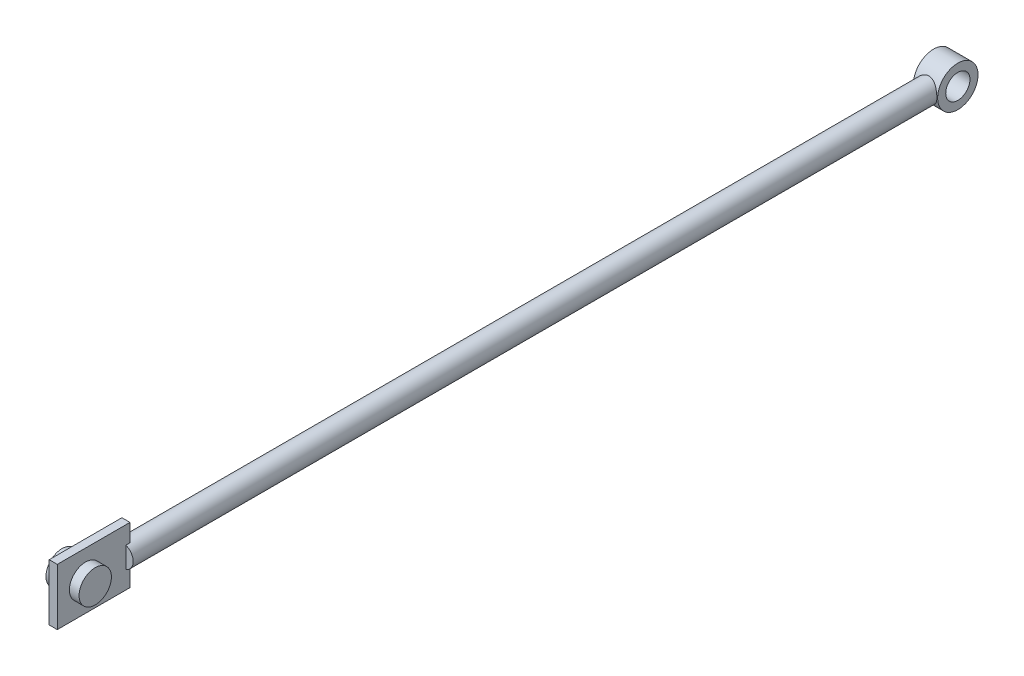
ISO-10303-21;
HEADER;
FILE_DESCRIPTION(('STEP AP214'),'2;1');
FILE_NAME('part.step','',(''),(''),'','','');
FILE_SCHEMA(('AUTOMOTIVE_DESIGN { 1 0 10303 214 1 1 1 1 }'));
ENDSEC;
DATA;
#1=APPLICATION_CONTEXT('core data for automotive mechanical design processes');
#2=APPLICATION_PROTOCOL_DEFINITION('international standard','automotive_design',2000,#1);
#3=PRODUCT_CONTEXT('',#1,'mechanical');
#4=PRODUCT('Part','Part','',(#3));
#5=PRODUCT_RELATED_PRODUCT_CATEGORY('part','',(#4));
#6=PRODUCT_DEFINITION_FORMATION('','',#4);
#7=PRODUCT_DEFINITION_CONTEXT('part definition',#1,'design');
#8=PRODUCT_DEFINITION('design','',#6,#7);
#9=PRODUCT_DEFINITION_SHAPE('','',#8);
#10=(LENGTH_UNIT() NAMED_UNIT(*) SI_UNIT(.MILLI.,.METRE.));
#11=(NAMED_UNIT(*) PLANE_ANGLE_UNIT() SI_UNIT($,.RADIAN.));
#12=(NAMED_UNIT(*) SI_UNIT($,.STERADIAN.) SOLID_ANGLE_UNIT());
#13=UNCERTAINTY_MEASURE_WITH_UNIT(LENGTH_MEASURE(1.E-05),#10,'distance_accuracy_value','');
#14=(GEOMETRIC_REPRESENTATION_CONTEXT(3) GLOBAL_UNCERTAINTY_ASSIGNED_CONTEXT((#13)) GLOBAL_UNIT_ASSIGNED_CONTEXT((#10,
#11,#12)) REPRESENTATION_CONTEXT('',''));
#15=CARTESIAN_POINT('',(0.,0.,0.));
#16=DIRECTION('',(0.,0.,1.));
#17=DIRECTION('',(1.,0.,0.));
#18=AXIS2_PLACEMENT_3D('',#15,#16,#17);
#19=CARTESIAN_POINT('',(0.,0.,100.));
#20=DIRECTION('',(0.,0.,-1.));
#21=DIRECTION('',(-1.,0.,0.));
#22=AXIS2_PLACEMENT_3D('',#19,#20,#21);
#23=CYLINDRICAL_SURFACE('',#22,1.4);
#24=CARTESIAN_POINT('',(-1.4,0.,0.499999999999998));
#25=CARTESIAN_POINT('',(-1.40000289659873,-0.0725818689730918,0.500002520776899));
#26=CARTESIAN_POINT('',(-1.39433133035632,-0.145147059210999,0.496812613091404));
#27=CARTESIAN_POINT('',(-1.37196021256065,-0.288016997267102,0.484388938821093));
#28=CARTESIAN_POINT('',(-1.35525926953171,-0.35832145869601,0.475154409642917));
#29=CARTESIAN_POINT('',(-1.3117124098072,-0.494475170763166,0.451582636287804));
#30=CARTESIAN_POINT('',(-1.28490387285422,-0.560339795458176,0.4372642045506));
#31=CARTESIAN_POINT('',(-1.22215902977669,-0.686510478104349,0.404777141676712));
#32=CARTESIAN_POINT('',(-1.18622048846178,-0.746815169948827,0.386607567891455));
#33=CARTESIAN_POINT('',(-1.10340706767021,-0.864901258370252,0.34650853836439));
#34=CARTESIAN_POINT('',(-1.05594134550337,-0.922207928188873,0.324404634506324));
#35=CARTESIAN_POINT('',(-0.952721258461023,-1.02850336667495,0.279368325353988));
#36=CARTESIAN_POINT('',(-0.896958365530866,-1.07748346476577,0.256435086224085));
#37=CARTESIAN_POINT('',(-0.771889428270987,-1.17085060892693,0.209549655418918));
#38=CARTESIAN_POINT('',(-0.701779248609789,-1.21423931000865,0.185737232860964));
#39=CARTESIAN_POINT('',(-0.553881240003987,-1.28842263311707,0.142851816901154));
#40=CARTESIAN_POINT('',(-0.476104772318213,-1.31923555387748,0.123771953243341));
#41=CARTESIAN_POINT('',(-0.332085921068109,-1.3616501036544,0.096759663144412));
#42=CARTESIAN_POINT('',(-0.266920664324053,-1.37594726130742,0.0873177352789558));
#43=CARTESIAN_POINT('',(-0.134653309423798,-1.3951063945149,0.0745642457264337));
#44=CARTESIAN_POINT('',(-0.0675532343343101,-1.39997788675499,0.0712465008732006));
#45=CARTESIAN_POINT('',(0.0667273688799501,-1.40002199297853,0.0712166158174327));
#46=CARTESIAN_POINT('',(0.133907899577255,-1.39518329024686,0.0745121830778766));
#47=CARTESIAN_POINT('',(0.266325246678815,-1.37606434146031,0.0872406395516563));
#48=CARTESIAN_POINT('',(0.331560749621589,-1.3617778598451,0.0966775820241706));
#49=CARTESIAN_POINT('',(0.458435728199665,-1.32446590427588,0.120441630267713));
#50=CARTESIAN_POINT('',(0.52007824241421,-1.30144794194266,0.134764531624939));
#51=CARTESIAN_POINT('',(0.638826601856177,-1.24746154369203,0.166753855604164));
#52=CARTESIAN_POINT('',(0.69593067248779,-1.21649001765185,0.184421577054746));
#53=CARTESIAN_POINT('',(0.813333390049971,-1.14194614545546,0.224412105531137));
#54=CARTESIAN_POINT('',(0.872765521257123,-1.09716690393685,0.247032557278383));
#55=CARTESIAN_POINT('',(0.983817953241206,-0.998804901734401,0.292450034384635));
#56=CARTESIAN_POINT('',(1.03543188432828,-0.945215036141927,0.31524718798208));
#57=CARTESIAN_POINT('',(1.13480526712122,-0.824002455402963,0.361280352815449));
#58=CARTESIAN_POINT('',(1.18159433217778,-0.755497761421246,0.384312104599013));
#59=CARTESIAN_POINT('',(1.26277350980702,-0.61017638348568,0.425566703482692));
#60=CARTESIAN_POINT('',(1.29717170587447,-0.533365161191365,0.443792683660846));
#61=CARTESIAN_POINT('',(1.34994472441148,-0.379219300123221,0.472224265096275));
#62=CARTESIAN_POINT('',(1.36927831803769,-0.302303425618091,0.482904759757533));
#63=CARTESIAN_POINT('',(1.39465188805837,-0.145680772914427,0.496985820810131));
#64=CARTESIAN_POINT('',(1.4007039746224,-0.0659766045407336,0.500393018965905));
#65=CARTESIAN_POINT('',(1.39925261968606,0.0840088573455026,0.499582535532475));
#66=CARTESIAN_POINT('',(1.39323471047337,0.154314771743416,0.496200415033575));
#67=CARTESIAN_POINT('',(1.3708471787942,0.292732551809141,0.483774353051265));
#68=CARTESIAN_POINT('',(1.35447726128163,0.360844354883693,0.474730250193856));
#69=CARTESIAN_POINT('',(1.31223831892189,0.492752800665483,0.451868166288269));
#70=CARTESIAN_POINT('',(1.28642130771762,0.556570848252344,0.438076349304474));
#71=CARTESIAN_POINT('',(1.22620339618653,0.679033093012462,0.406847066343065));
#72=CARTESIAN_POINT('',(1.19180026394243,0.737675939545726,0.389408652643086));
#73=CARTESIAN_POINT('',(1.11136164316869,0.85464758636355,0.350268805988279));
#74=CARTESIAN_POINT('',(1.0644909391045,0.912316233413862,0.328312983942214));
#75=CARTESIAN_POINT('',(0.962431001856964,1.01941549241508,0.28345593500925));
#76=CARTESIAN_POINT('',(0.907232503894289,1.06883679847808,0.260553676066011));
#77=CARTESIAN_POINT('',(0.783301255665095,1.16323731293619,0.21357993795462));
#78=CARTESIAN_POINT('',(0.713758476060063,1.20722360376429,0.189633692040427));
#79=CARTESIAN_POINT('',(0.566931533571026,1.28272281277869,0.146282221624338));
#80=CARTESIAN_POINT('',(0.489658360633218,1.31425313191436,0.126870677773245));
#81=CARTESIAN_POINT('',(0.346156638607792,1.35814700997934,0.0990390995862444));
#82=CARTESIAN_POINT('',(0.281016167639343,1.37314501906902,0.0891669368254054));
#83=CARTESIAN_POINT('',(0.148660704944315,1.39369032223819,0.0755205881555154));
#84=CARTESIAN_POINT('',(0.0814479394137579,1.39924742133139,0.0717400758724399));
#85=CARTESIAN_POINT('',(-0.0532193613632115,1.40061028195422,0.0708191382454962));
#86=CARTESIAN_POINT('',(-0.120674105648377,1.39640193637516,0.0736883190049249));
#87=CARTESIAN_POINT('',(-0.253746219572148,1.37845110967393,0.0856614578369806));
#88=CARTESIAN_POINT('',(-0.319362386731057,1.36470253372663,0.094769401527454));
#89=CARTESIAN_POINT('',(-0.446675308333879,1.32847150200962,0.117927326520317));
#90=CARTESIAN_POINT('',(-0.508395695307994,1.30604911543395,0.13194325635333));
#91=CARTESIAN_POINT('',(-0.627379288622175,1.25325063054657,0.163401294633207));
#92=CARTESIAN_POINT('',(-0.684640784809243,1.22287149982575,0.180844708700302));
#93=CARTESIAN_POINT('',(-0.802323768369586,1.14968661812875,0.220405264726634));
#94=CARTESIAN_POINT('',(-0.861904874912207,1.10569440990223,0.242829900540194));
#95=CARTESIAN_POINT('',(-0.973389485192732,1.00894376720332,0.287987397677737));
#96=CARTESIAN_POINT('',(-1.02528667749394,0.956178201133428,0.31072049582112));
#97=CARTESIAN_POINT('',(-1.12565756005663,0.83644662113147,0.356884821501152));
#98=CARTESIAN_POINT('',(-1.17313203191453,0.768557958915536,0.380119315165633));
#99=CARTESIAN_POINT('',(-1.25580761348377,0.624371405225455,0.421937306955919));
#100=CARTESIAN_POINT('',(-1.29101604650596,0.548078567315719,0.440523578377626));
#101=CARTESIAN_POINT('',(-1.34563219915199,0.394320657231988,0.469864545976503));
#102=CARTESIAN_POINT('',(-1.36591563693658,0.31725158132947,0.4810485262019));
#103=CARTESIAN_POINT('',(-1.39309197491046,0.160113082948893,0.496111609080858));
#104=CARTESIAN_POINT('',(-1.39999680550667,0.0800463986147504,0.4999972199791));
#105=CARTESIAN_POINT('',(-1.4,0.,0.499999999999998));
#106=B_SPLINE_CURVE_WITH_KNOTS('',3,(#24,#25,#26,#27,#28,#29,#30,#31,#32,#33,#34,#35,#36,#37,
#38,#39,#40,#41,#42,#43,#44,#45,#46,#47,#48,#49,#50,#51,#52,#53,#54,#55,#56,#57,#58,#59,#60,#61,
#62,#63,#64,#65,#66,#67,#68,#69,#70,#71,#72,#73,#74,#75,#76,#77,#78,#79,#80,#81,#82,#83,#84,#85,
#86,#87,#88,#89,#90,#91,#92,#93,#94,#95,#96,#97,#98,#99,#100,#101,#102,#103,#104,#105),
.UNSPECIFIED.,.T.,.F.,(4,2,2,2,2,2,2,2,2,2,2,2,2,2,2,2,2,2,2,2,2,2,2,2,2,2,2,2,2,2,2,2,2,2,2,2,
2,2,2,2,4),(0.,0.217435512517166,0.434898462127869,0.651564958945524,0.868284550848014,
1.10022589213456,1.33240729712488,1.58859231253333,1.84440321838644,2.04566432080885,
2.24672211236853,2.44801436216047,2.64943959816538,2.85069194125705,3.05202259362406,
3.28441685131827,3.51699943986532,3.77394969791921,4.03073202312733,4.26940910410352,
4.50786846709432,4.71877390395926,4.92968535218223,5.13945262304555,5.34927447871156,
5.58080367166495,5.81259236960018,6.06843034205975,6.32390963505654,6.52574183023127,
6.72736428079795,6.92927817535459,7.13132118254214,7.33198932166183,7.53273404934172,
7.76395996958626,7.99537477361488,8.25216210224237,8.50879585486682,8.74880719470862,
8.98860440514424),.UNSPECIFIED.);
#107=CARTESIAN_POINT('',(-1.4,0.,0.499999999999998));
#108=VERTEX_POINT('',#107);
#109=EDGE_CURVE('E153',#108,#108,#106,.T.);
#110=ORIENTED_EDGE('',*,*,#109,.T.);
#111=EDGE_LOOP('',(#110));
#112=FACE_BOUND('',#111,.T.);
#113=DIRECTION('',(0.,0.,-1.));
#114=VECTOR('',#113,1.);
#115=CARTESIAN_POINT('',(-0.5,1.3076696830622,100.));
#116=LINE('',#115,#114);
#117=CARTESIAN_POINT('',(-0.5,1.3076696830622,99.5));
#118=VERTEX_POINT('',#117);
#119=CARTESIAN_POINT('',(-0.5,1.3076696830622,100.));
#120=VERTEX_POINT('',#119);
#121=EDGE_CURVE('E63',#118,#120,#116,.F.);
#122=ORIENTED_EDGE('',*,*,#121,.F.);
#123=CARTESIAN_POINT('',(0.,0.,99.5));
#124=DIRECTION('',(0.,0.,1.));
#125=DIRECTION('',(1.,0.,0.));
#126=AXIS2_PLACEMENT_3D('',#123,#124,#125);
#127=CIRCLE('',#126,1.4);
#128=CARTESIAN_POINT('',(0.5,1.3076696830622,99.5));
#129=VERTEX_POINT('',#128);
#130=EDGE_CURVE('E11',#129,#118,#127,.T.);
#131=ORIENTED_EDGE('',*,*,#130,.F.);
#132=DIRECTION('',(0.,0.,-1.));
#133=VECTOR('',#132,1.);
#134=CARTESIAN_POINT('',(0.5,1.3076696830622,100.));
#135=LINE('',#134,#133);
#136=CARTESIAN_POINT('',(0.5,1.3076696830622,100.));
#137=VERTEX_POINT('',#136);
#138=EDGE_CURVE('E131',#137,#129,#135,.T.);
#139=ORIENTED_EDGE('',*,*,#138,.F.);
#140=CARTESIAN_POINT('',(0.,0.,100.));
#141=DIRECTION('',(0.,0.,1.));
#142=DIRECTION('',(1.,0.,0.));
#143=AXIS2_PLACEMENT_3D('',#140,#141,#142);
#144=CIRCLE('',#143,1.4);
#145=CARTESIAN_POINT('',(0.5,-1.3076696830622,100.));
#146=VERTEX_POINT('',#145);
#147=EDGE_CURVE('E154',#146,#137,#144,.T.);
#148=ORIENTED_EDGE('',*,*,#147,.F.);
#149=DIRECTION('',(0.,0.,-1.));
#150=VECTOR('',#149,1.);
#151=CARTESIAN_POINT('',(0.5,-1.3076696830622,100.));
#152=LINE('',#151,#150);
#153=CARTESIAN_POINT('',(0.5,-1.3076696830622,99.5));
#154=VERTEX_POINT('',#153);
#155=EDGE_CURVE('E55',#154,#146,#152,.F.);
#156=ORIENTED_EDGE('',*,*,#155,.F.);
#157=CARTESIAN_POINT('',(-0.5,-1.3076696830622,99.5));
#158=VERTEX_POINT('',#157);
#159=EDGE_CURVE('E48',#158,#154,#127,.T.);
#160=ORIENTED_EDGE('',*,*,#159,.F.);
#161=DIRECTION('',(0.,0.,-1.));
#162=VECTOR('',#161,1.);
#163=CARTESIAN_POINT('',(-0.5,-1.3076696830622,100.));
#164=LINE('',#163,#162);
#165=CARTESIAN_POINT('',(-0.5,-1.3076696830622,100.));
#166=VERTEX_POINT('',#165);
#167=EDGE_CURVE('E139',#166,#158,#164,.T.);
#168=ORIENTED_EDGE('',*,*,#167,.F.);
#169=EDGE_CURVE('E157',#120,#166,#144,.T.);
#170=ORIENTED_EDGE('',*,*,#169,.F.);
#171=EDGE_LOOP('',(#122,#131,#139,#148,#156,#160,#168,#170));
#172=FACE_BOUND('',#171,.T.);
#173=ADVANCED_FACE('F39',(#112,#172),#23,.T.);
#174=CARTESIAN_POINT('',(0.,0.,100.));
#175=DIRECTION('',(0.,0.,1.));
#176=DIRECTION('',(1.,0.,0.));
#177=AXIS2_PLACEMENT_3D('',#174,#175,#176);
#178=PLANE('',#177);
#179=ORIENTED_EDGE('',*,*,#169,.T.);
#180=DIRECTION('',(0.,1.,0.));
#181=VECTOR('',#180,1.);
#182=CARTESIAN_POINT('',(-0.5,0.,100.));
#183=LINE('',#182,#181);
#184=EDGE_CURVE('E189',#166,#120,#183,.T.);
#185=ORIENTED_EDGE('',*,*,#184,.T.);
#186=EDGE_LOOP('',(#179,#185));
#187=FACE_BOUND('',#186,.T.);
#188=ADVANCED_FACE('F178',(#187),#178,.T.);
#189=ORIENTED_EDGE('',*,*,#147,.T.);
#190=DIRECTION('',(0.,-1.,0.));
#191=VECTOR('',#190,1.);
#192=CARTESIAN_POINT('',(0.5,0.,100.));
#193=LINE('',#192,#191);
#194=EDGE_CURVE('E164',#137,#146,#193,.T.);
#195=ORIENTED_EDGE('',*,*,#194,.T.);
#196=EDGE_LOOP('',(#189,#195));
#197=FACE_BOUND('',#196,.T.);
#198=ADVANCED_FACE('F172',(#197),#178,.T.);
#199=CARTESIAN_POINT('',(-2.44255249329331,0.,-2.));
#200=DIRECTION('',(-1.,0.,0.));
#201=DIRECTION('',(0.,0.,1.));
#202=AXIS2_PLACEMENT_3D('',#199,#200,#201);
#203=CYLINDRICAL_SURFACE('',#202,2.5);
#204=CARTESIAN_POINT('',(1.5,0.,-2.));
#205=DIRECTION('',(-1.,0.,0.));
#206=DIRECTION('',(0.,0.,1.));
#207=AXIS2_PLACEMENT_3D('',#204,#205,#206);
#208=CIRCLE('',#207,2.5);
#209=CARTESIAN_POINT('',(1.5,0.,0.5));
#210=VERTEX_POINT('',#209);
#211=EDGE_CURVE('E147',#210,#210,#208,.T.);
#212=ORIENTED_EDGE('',*,*,#211,.T.);
#213=EDGE_LOOP('',(#212));
#214=FACE_BOUND('',#213,.T.);
#215=CARTESIAN_POINT('',(-1.5,0.,-2.));
#216=DIRECTION('',(-1.,0.,0.));
#217=DIRECTION('',(0.,0.,1.));
#218=AXIS2_PLACEMENT_3D('',#215,#216,#217);
#219=CIRCLE('',#218,2.5);
#220=CARTESIAN_POINT('',(-1.5,0.,0.5));
#221=VERTEX_POINT('',#220);
#222=EDGE_CURVE('E150',#221,#221,#219,.T.);
#223=ORIENTED_EDGE('',*,*,#222,.F.);
#224=EDGE_LOOP('',(#223));
#225=FACE_BOUND('',#224,.T.);
#226=ORIENTED_EDGE('',*,*,#109,.F.);
#227=EDGE_LOOP('',(#226));
#228=FACE_BOUND('',#227,.T.);
#229=ADVANCED_FACE('F166',(#214,#225,#228),#203,.T.);
#230=CARTESIAN_POINT('',(-1.5,0.,-0.5));
#231=DIRECTION('',(-1.,0.,0.));
#232=DIRECTION('',(0.,0.,1.));
#233=AXIS2_PLACEMENT_3D('',#230,#231,#232);
#234=PLANE('',#233);
#235=ORIENTED_EDGE('',*,*,#222,.T.);
#236=EDGE_LOOP('',(#235));
#237=FACE_BOUND('',#236,.T.);
#238=CARTESIAN_POINT('',(-1.5,0.,-2.));
#239=DIRECTION('',(-1.,0.,0.));
#240=DIRECTION('',(0.,0.,1.));
#241=AXIS2_PLACEMENT_3D('',#238,#239,#240);
#242=CIRCLE('',#241,1.5);
#243=CARTESIAN_POINT('',(-1.5,0.,-0.5));
#244=VERTEX_POINT('',#243);
#245=EDGE_CURVE('E141',#244,#244,#242,.T.);
#246=ORIENTED_EDGE('',*,*,#245,.F.);
#247=EDGE_LOOP('',(#246));
#248=FACE_BOUND('',#247,.T.);
#249=ADVANCED_FACE('F171',(#237,#248),#234,.T.);
#250=CARTESIAN_POINT('',(1.5,0.,-0.5));
#251=DIRECTION('',(1.,0.,0.));
#252=DIRECTION('',(0.,0.,-1.));
#253=AXIS2_PLACEMENT_3D('',#250,#251,#252);
#254=PLANE('',#253);
#255=CARTESIAN_POINT('',(1.5,0.,-2.));
#256=DIRECTION('',(-1.,0.,0.));
#257=DIRECTION('',(0.,0.,1.));
#258=AXIS2_PLACEMENT_3D('',#255,#256,#257);
#259=CIRCLE('',#258,1.5);
#260=CARTESIAN_POINT('',(1.5,0.,-0.5));
#261=VERTEX_POINT('',#260);
#262=EDGE_CURVE('E144',#261,#261,#259,.T.);
#263=ORIENTED_EDGE('',*,*,#262,.T.);
#264=EDGE_LOOP('',(#263));
#265=FACE_BOUND('',#264,.T.);
#266=ORIENTED_EDGE('',*,*,#211,.F.);
#267=EDGE_LOOP('',(#266));
#268=FACE_BOUND('',#267,.T.);
#269=ADVANCED_FACE('F174',(#265,#268),#254,.T.);
#270=CARTESIAN_POINT('',(-2.44255249329331,0.,-2.));
#271=DIRECTION('',(-1.,0.,0.));
#272=DIRECTION('',(0.,0.,1.));
#273=AXIS2_PLACEMENT_3D('',#270,#271,#272);
#274=CYLINDRICAL_SURFACE('',#273,1.5);
#275=ORIENTED_EDGE('',*,*,#245,.T.);
#276=EDGE_LOOP('',(#275));
#277=FACE_BOUND('',#276,.T.);
#278=ORIENTED_EDGE('',*,*,#262,.F.);
#279=EDGE_LOOP('',(#278));
#280=FACE_BOUND('',#279,.T.);
#281=ADVANCED_FACE('F255',(#277,#280),#274,.F.);
#282=CARTESIAN_POINT('',(0.,0.,99.5));
#283=DIRECTION('',(0.,0.,1.));
#284=DIRECTION('',(1.,0.,0.));
#285=AXIS2_PLACEMENT_3D('',#282,#283,#284);
#286=PLANE('',#285);
#287=DIRECTION('',(0.,1.,0.));
#288=VECTOR('',#287,1.);
#289=CARTESIAN_POINT('',(0.5,3.5,99.5));
#290=LINE('',#289,#288);
#291=CARTESIAN_POINT('',(0.5,3.5,99.5));
#292=VERTEX_POINT('',#291);
#293=EDGE_CURVE('E199',#129,#292,#290,.T.);
#294=ORIENTED_EDGE('',*,*,#293,.F.);
#295=ORIENTED_EDGE('',*,*,#130,.T.);
#296=DIRECTION('',(0.,-1.,0.));
#297=VECTOR('',#296,1.);
#298=CARTESIAN_POINT('',(-0.5,3.5,99.5));
#299=LINE('',#298,#297);
#300=CARTESIAN_POINT('',(-0.5,3.5,99.5));
#301=VERTEX_POINT('',#300);
#302=EDGE_CURVE('E211',#301,#118,#299,.T.);
#303=ORIENTED_EDGE('',*,*,#302,.F.);
#304=DIRECTION('',(-1.,0.,0.));
#305=VECTOR('',#304,1.);
#306=CARTESIAN_POINT('',(-0.5,3.5,99.5));
#307=LINE('',#306,#305);
#308=EDGE_CURVE('E124',#292,#301,#307,.T.);
#309=ORIENTED_EDGE('',*,*,#308,.F.);
#310=EDGE_LOOP('',(#294,#295,#303,#309));
#311=FACE_BOUND('',#310,.T.);
#312=ADVANCED_FACE('F208',(#311),#286,.F.);
#313=CARTESIAN_POINT('',(-0.5,3.5,108.5));
#314=DIRECTION('',(1.,0.,0.));
#315=DIRECTION('',(0.,1.,0.));
#316=AXIS2_PLACEMENT_3D('',#313,#314,#315);
#317=PLANE('',#316);
#318=CARTESIAN_POINT('',(-0.5,0.,105.));
#319=DIRECTION('',(1.,0.,0.));
#320=DIRECTION('',(0.,1.,0.));
#321=AXIS2_PLACEMENT_3D('',#318,#319,#320);
#322=CIRCLE('',#321,2.);
#323=CARTESIAN_POINT('',(-0.5,2.,105.));
#324=VERTEX_POINT('',#323);
#325=EDGE_CURVE('E221',#324,#324,#322,.T.);
#326=ORIENTED_EDGE('',*,*,#325,.T.);
#327=EDGE_LOOP('',(#326));
#328=FACE_BOUND('',#327,.T.);
#329=ORIENTED_EDGE('',*,*,#184,.F.);
#330=ORIENTED_EDGE('',*,*,#167,.T.);
#331=CARTESIAN_POINT('',(-0.5,-3.5,99.5));
#332=VERTEX_POINT('',#331);
#333=EDGE_CURVE('E128',#158,#332,#299,.T.);
#334=ORIENTED_EDGE('',*,*,#333,.T.);
#335=DIRECTION('',(0.,0.,-1.));
#336=VECTOR('',#335,1.);
#337=CARTESIAN_POINT('',(-0.5,-3.5,108.5));
#338=LINE('',#337,#336);
#339=CARTESIAN_POINT('',(-0.5,-3.5,108.5));
#340=VERTEX_POINT('',#339);
#341=EDGE_CURVE('E110',#340,#332,#338,.T.);
#342=ORIENTED_EDGE('',*,*,#341,.F.);
#343=DIRECTION('',(0.,-1.,0.));
#344=VECTOR('',#343,1.);
#345=CARTESIAN_POINT('',(-0.5,3.5,108.5));
#346=LINE('',#345,#344);
#347=CARTESIAN_POINT('',(-0.5,3.5,108.5));
#348=VERTEX_POINT('',#347);
#349=EDGE_CURVE('E116',#348,#340,#346,.T.);
#350=ORIENTED_EDGE('',*,*,#349,.F.);
#351=DIRECTION('',(0.,0.,-1.));
#352=VECTOR('',#351,1.);
#353=CARTESIAN_POINT('',(-0.5,3.5,108.5));
#354=LINE('',#353,#352);
#355=EDGE_CURVE('E216',#348,#301,#354,.T.);
#356=ORIENTED_EDGE('',*,*,#355,.T.);
#357=ORIENTED_EDGE('',*,*,#302,.T.);
#358=ORIENTED_EDGE('',*,*,#121,.T.);
#359=EDGE_LOOP('',(#329,#330,#334,#342,#350,#356,#357,#358));
#360=FACE_BOUND('',#359,.T.);
#361=ADVANCED_FACE('F126',(#328,#360),#317,.F.);
#362=CARTESIAN_POINT('',(0.5,3.5,108.5));
#363=DIRECTION('',(-1.,0.,0.));
#364=DIRECTION('',(0.,-1.,0.));
#365=AXIS2_PLACEMENT_3D('',#362,#363,#364);
#366=PLANE('',#365);
#367=CARTESIAN_POINT('',(0.5,0.,105.));
#368=DIRECTION('',(-1.,0.,0.));
#369=DIRECTION('',(0.,-1.,0.));
#370=AXIS2_PLACEMENT_3D('',#367,#368,#369);
#371=CIRCLE('',#370,2.);
#372=CARTESIAN_POINT('',(0.5,-2.,105.));
#373=VERTEX_POINT('',#372);
#374=EDGE_CURVE('E43',#373,#373,#371,.T.);
#375=ORIENTED_EDGE('',*,*,#374,.T.);
#376=EDGE_LOOP('',(#375));
#377=FACE_BOUND('',#376,.T.);
#378=ORIENTED_EDGE('',*,*,#194,.F.);
#379=ORIENTED_EDGE('',*,*,#138,.T.);
#380=ORIENTED_EDGE('',*,*,#293,.T.);
#381=DIRECTION('',(0.,0.,-1.));
#382=VECTOR('',#381,1.);
#383=CARTESIAN_POINT('',(0.5,3.5,108.5));
#384=LINE('',#383,#382);
#385=CARTESIAN_POINT('',(0.5,3.5,108.5));
#386=VERTEX_POINT('',#385);
#387=EDGE_CURVE('E133',#386,#292,#384,.T.);
#388=ORIENTED_EDGE('',*,*,#387,.F.);
#389=DIRECTION('',(0.,1.,0.));
#390=VECTOR('',#389,1.);
#391=CARTESIAN_POINT('',(0.5,3.5,108.5));
#392=LINE('',#391,#390);
#393=CARTESIAN_POINT('',(0.500000000000001,-3.5,108.5));
#394=VERTEX_POINT('',#393);
#395=EDGE_CURVE('E115',#394,#386,#392,.T.);
#396=ORIENTED_EDGE('',*,*,#395,.F.);
#397=DIRECTION('',(0.,0.,-1.));
#398=VECTOR('',#397,1.);
#399=CARTESIAN_POINT('',(0.500000000000001,-3.5,108.5));
#400=LINE('',#399,#398);
#401=CARTESIAN_POINT('',(0.500000000000001,-3.5,99.5));
#402=VERTEX_POINT('',#401);
#403=EDGE_CURVE('E112',#394,#402,#400,.T.);
#404=ORIENTED_EDGE('',*,*,#403,.T.);
#405=EDGE_CURVE('E197',#402,#154,#290,.T.);
#406=ORIENTED_EDGE('',*,*,#405,.T.);
#407=ORIENTED_EDGE('',*,*,#155,.T.);
#408=EDGE_LOOP('',(#378,#379,#380,#388,#396,#404,#406,#407));
#409=FACE_BOUND('',#408,.T.);
#410=ADVANCED_FACE('F198',(#377,#409),#366,.F.);
#411=CARTESIAN_POINT('',(-0.5,-3.5,108.5));
#412=DIRECTION('',(0.,1.,0.));
#413=DIRECTION('',(0.,0.,1.));
#414=AXIS2_PLACEMENT_3D('',#411,#412,#413);
#415=PLANE('',#414);
#416=DIRECTION('',(1.,0.,0.));
#417=VECTOR('',#416,1.);
#418=CARTESIAN_POINT('',(-0.5,-3.5,99.5));
#419=LINE('',#418,#417);
#420=EDGE_CURVE('E210',#332,#402,#419,.T.);
#421=ORIENTED_EDGE('',*,*,#420,.T.);
#422=ORIENTED_EDGE('',*,*,#403,.F.);
#423=DIRECTION('',(1.,0.,0.));
#424=VECTOR('',#423,1.);
#425=CARTESIAN_POINT('',(-0.5,-3.5,108.5));
#426=LINE('',#425,#424);
#427=EDGE_CURVE('E106',#340,#394,#426,.T.);
#428=ORIENTED_EDGE('',*,*,#427,.F.);
#429=ORIENTED_EDGE('',*,*,#341,.T.);
#430=EDGE_LOOP('',(#421,#422,#428,#429));
#431=FACE_BOUND('',#430,.T.);
#432=ADVANCED_FACE('F108',(#431),#415,.F.);
#433=CARTESIAN_POINT('',(-0.5,3.5,108.5));
#434=DIRECTION('',(0.,-1.,0.));
#435=DIRECTION('',(0.,0.,-1.));
#436=AXIS2_PLACEMENT_3D('',#433,#434,#435);
#437=PLANE('',#436);
#438=ORIENTED_EDGE('',*,*,#308,.T.);
#439=ORIENTED_EDGE('',*,*,#355,.F.);
#440=DIRECTION('',(-1.,0.,0.));
#441=VECTOR('',#440,1.);
#442=CARTESIAN_POINT('',(-0.5,3.5,108.5));
#443=LINE('',#442,#441);
#444=EDGE_CURVE('E121',#386,#348,#443,.T.);
#445=ORIENTED_EDGE('',*,*,#444,.F.);
#446=ORIENTED_EDGE('',*,*,#387,.T.);
#447=EDGE_LOOP('',(#438,#439,#445,#446));
#448=FACE_BOUND('',#447,.T.);
#449=ADVANCED_FACE('F218',(#448),#437,.F.);
#450=CARTESIAN_POINT('',(0.,0.,108.5));
#451=DIRECTION('',(0.,0.,1.));
#452=DIRECTION('',(1.,0.,0.));
#453=AXIS2_PLACEMENT_3D('',#450,#451,#452);
#454=PLANE('',#453);
#455=ORIENTED_EDGE('',*,*,#349,.T.);
#456=ORIENTED_EDGE('',*,*,#427,.T.);
#457=ORIENTED_EDGE('',*,*,#395,.T.);
#458=ORIENTED_EDGE('',*,*,#444,.T.);
#459=EDGE_LOOP('',(#455,#456,#457,#458));
#460=FACE_BOUND('',#459,.T.);
#461=ADVANCED_FACE('F119',(#460),#454,.T.);
#462=ORIENTED_EDGE('',*,*,#333,.F.);
#463=ORIENTED_EDGE('',*,*,#159,.T.);
#464=ORIENTED_EDGE('',*,*,#405,.F.);
#465=ORIENTED_EDGE('',*,*,#420,.F.);
#466=EDGE_LOOP('',(#462,#463,#464,#465));
#467=FACE_BOUND('',#466,.T.);
#468=ADVANCED_FACE('F196',(#467),#286,.F.);
#469=CARTESIAN_POINT('',(1.7,0.,105.));
#470=DIRECTION('',(1.,0.,0.));
#471=DIRECTION('',(0.,0.,-1.));
#472=AXIS2_PLACEMENT_3D('',#469,#470,#471);
#473=PLANE('',#472);
#474=CARTESIAN_POINT('',(1.7,0.,105.));
#475=DIRECTION('',(1.,0.,0.));
#476=DIRECTION('',(0.,0.,-1.));
#477=AXIS2_PLACEMENT_3D('',#474,#475,#476);
#478=CIRCLE('',#477,2.);
#479=CARTESIAN_POINT('',(1.7,0.,103.));
#480=VERTEX_POINT('',#479);
#481=EDGE_CURVE('E231',#480,#480,#478,.T.);
#482=ORIENTED_EDGE('',*,*,#481,.T.);
#483=EDGE_LOOP('',(#482));
#484=FACE_BOUND('',#483,.T.);
#485=ADVANCED_FACE('F235',(#484),#473,.T.);
#486=CARTESIAN_POINT('',(-2.4,0.,105.));
#487=DIRECTION('',(1.,0.,0.));
#488=DIRECTION('',(0.,0.,-1.));
#489=AXIS2_PLACEMENT_3D('',#486,#487,#488);
#490=CYLINDRICAL_SURFACE('',#489,2.);
#491=ORIENTED_EDGE('',*,*,#481,.F.);
#492=EDGE_LOOP('',(#491));
#493=FACE_BOUND('',#492,.T.);
#494=ORIENTED_EDGE('',*,*,#374,.F.);
#495=EDGE_LOOP('',(#494));
#496=FACE_BOUND('',#495,.T.);
#497=ADVANCED_FACE('F237',(#493,#496),#490,.T.);
#498=CARTESIAN_POINT('',(-2.4,0.,105.));
#499=DIRECTION('',(1.,0.,0.));
#500=DIRECTION('',(0.,0.,-1.));
#501=AXIS2_PLACEMENT_3D('',#498,#499,#500);
#502=CIRCLE('',#501,2.);
#503=CARTESIAN_POINT('',(-2.4,0.,103.));
#504=VERTEX_POINT('',#503);
#505=EDGE_CURVE('E227',#504,#504,#502,.T.);
#506=ORIENTED_EDGE('',*,*,#505,.T.);
#507=EDGE_LOOP('',(#506));
#508=FACE_BOUND('',#507,.T.);
#509=ORIENTED_EDGE('',*,*,#325,.F.);
#510=EDGE_LOOP('',(#509));
#511=FACE_BOUND('',#510,.T.);
#512=ADVANCED_FACE('F240',(#508,#511),#490,.T.);
#513=CARTESIAN_POINT('',(-2.4,0.,105.));
#514=DIRECTION('',(1.,0.,0.));
#515=DIRECTION('',(0.,0.,-1.));
#516=AXIS2_PLACEMENT_3D('',#513,#514,#515);
#517=PLANE('',#516);
#518=ORIENTED_EDGE('',*,*,#505,.F.);
#519=EDGE_LOOP('',(#518));
#520=FACE_BOUND('',#519,.T.);
#521=ADVANCED_FACE('F364',(#520),#517,.F.);
#522=CLOSED_SHELL('',(#173,#188,#198,#229,#249,#269,#281,#312,#361,#410,#432,#449,#461,#468,
#485,#497,#512,#521));
#523=MANIFOLD_SOLID_BREP('B2',#522);
#524=ADVANCED_BREP_SHAPE_REPRESENTATION('',(#18,#523),#14);
#525=SHAPE_DEFINITION_REPRESENTATION(#9,#524);
ENDSEC;
END-ISO-10303-21;
